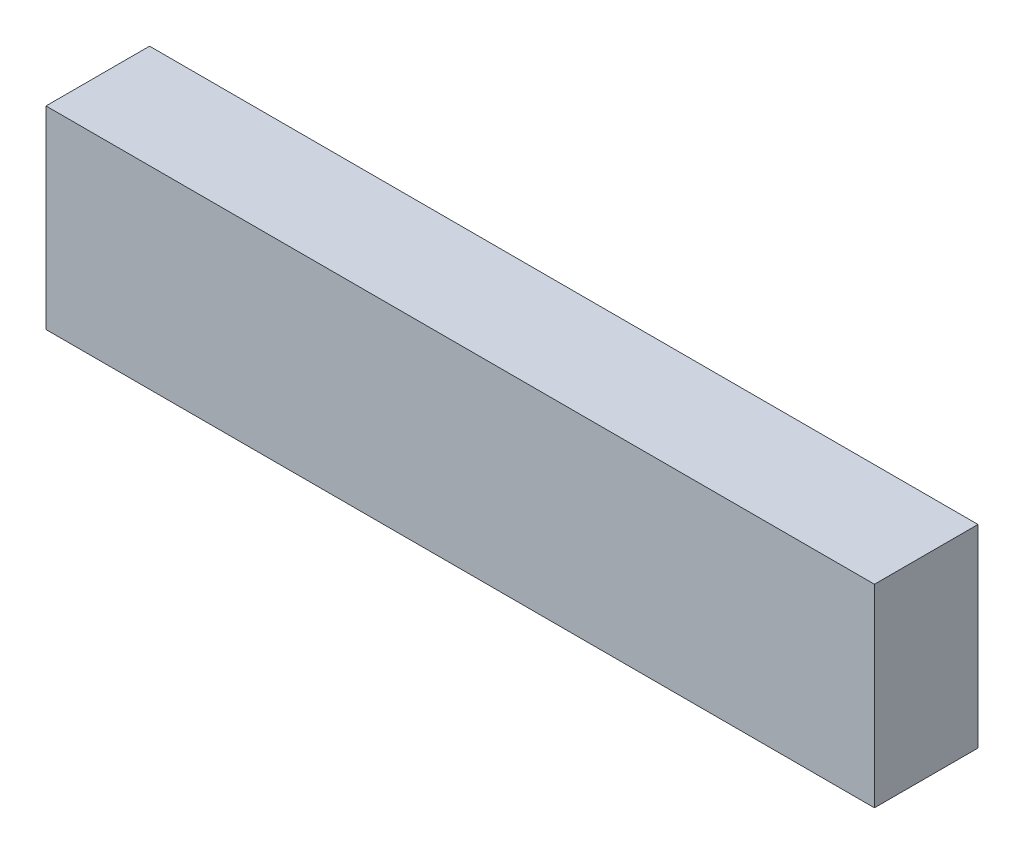
ISO-10303-21;
HEADER;
FILE_DESCRIPTION(('STEP AP214'),'2;1');
FILE_NAME('part.step','',(''),(''),'','','');
FILE_SCHEMA(('AUTOMOTIVE_DESIGN { 1 0 10303 214 1 1 1 1 }'));
ENDSEC;
DATA;
#1=APPLICATION_CONTEXT('core data for automotive mechanical design processes');
#2=APPLICATION_PROTOCOL_DEFINITION('international standard','automotive_design',2000,#1);
#3=PRODUCT_CONTEXT('',#1,'mechanical');
#4=PRODUCT('Part','Part','',(#3));
#5=PRODUCT_RELATED_PRODUCT_CATEGORY('part','',(#4));
#6=PRODUCT_DEFINITION_FORMATION('','',#4);
#7=PRODUCT_DEFINITION_CONTEXT('part definition',#1,'design');
#8=PRODUCT_DEFINITION('design','',#6,#7);
#9=PRODUCT_DEFINITION_SHAPE('','',#8);
#10=(LENGTH_UNIT() NAMED_UNIT(*) SI_UNIT(.MILLI.,.METRE.));
#11=(NAMED_UNIT(*) PLANE_ANGLE_UNIT() SI_UNIT($,.RADIAN.));
#12=(NAMED_UNIT(*) SI_UNIT($,.STERADIAN.) SOLID_ANGLE_UNIT());
#13=UNCERTAINTY_MEASURE_WITH_UNIT(LENGTH_MEASURE(1.E-05),#10,'distance_accuracy_value','');
#14=(GEOMETRIC_REPRESENTATION_CONTEXT(3) GLOBAL_UNCERTAINTY_ASSIGNED_CONTEXT((#13)) GLOBAL_UNIT_ASSIGNED_CONTEXT((#10,
#11,#12)) REPRESENTATION_CONTEXT('',''));
#15=CARTESIAN_POINT('',(0.,0.,0.));
#16=DIRECTION('',(0.,0.,1.));
#17=DIRECTION('',(1.,0.,0.));
#18=AXIS2_PLACEMENT_3D('',#15,#16,#17);
#19=CARTESIAN_POINT('',(0.,11.875,0.));
#20=DIRECTION('',(1.,0.,0.));
#21=DIRECTION('',(0.,0.,-1.));
#22=AXIS2_PLACEMENT_3D('',#19,#20,#21);
#23=PLANE('',#22);
#24=DIRECTION('',(0.,0.,1.));
#25=VECTOR('',#24,1.);
#26=CARTESIAN_POINT('',(0.,0.,0.));
#27=LINE('',#26,#25);
#28=CARTESIAN_POINT('',(0.,0.,0.));
#29=VERTEX_POINT('',#28);
#30=CARTESIAN_POINT('',(0.,0.,6.35));
#31=VERTEX_POINT('',#30);
#32=EDGE_CURVE('E113',#29,#31,#27,.T.);
#33=ORIENTED_EDGE('',*,*,#32,.T.);
#34=DIRECTION('',(0.,-1.,0.));
#35=VECTOR('',#34,1.);
#36=CARTESIAN_POINT('',(0.,11.875,6.35));
#37=LINE('',#36,#35);
#38=CARTESIAN_POINT('',(0.,11.875,6.35));
#39=VERTEX_POINT('',#38);
#40=EDGE_CURVE('E11',#39,#31,#37,.T.);
#41=ORIENTED_EDGE('',*,*,#40,.F.);
#42=DIRECTION('',(0.,0.,1.));
#43=VECTOR('',#42,1.);
#44=CARTESIAN_POINT('',(0.,11.875,0.));
#45=LINE('',#44,#43);
#46=CARTESIAN_POINT('',(0.,11.875,0.));
#47=VERTEX_POINT('',#46);
#48=EDGE_CURVE('E97',#47,#39,#45,.T.);
#49=ORIENTED_EDGE('',*,*,#48,.F.);
#50=DIRECTION('',(0.,-1.,0.));
#51=VECTOR('',#50,1.);
#52=CARTESIAN_POINT('',(0.,11.875,0.));
#53=LINE('',#52,#51);
#54=EDGE_CURVE('E109',#47,#29,#53,.T.);
#55=ORIENTED_EDGE('',*,*,#54,.T.);
#56=EDGE_LOOP('',(#33,#41,#49,#55));
#57=FACE_BOUND('',#56,.T.);
#58=ADVANCED_FACE('F45',(#57),#23,.F.);
#59=CARTESIAN_POINT('',(0.,11.875,6.35));
#60=DIRECTION('',(0.,0.,-1.));
#61=DIRECTION('',(-1.,0.,0.));
#62=AXIS2_PLACEMENT_3D('',#59,#60,#61);
#63=PLANE('',#62);
#64=DIRECTION('',(1.,0.,0.));
#65=VECTOR('',#64,1.);
#66=CARTESIAN_POINT('',(0.,0.,6.35));
#67=LINE('',#66,#65);
#68=CARTESIAN_POINT('',(50.8,0.,6.35));
#69=VERTEX_POINT('',#68);
#70=EDGE_CURVE('E102',#31,#69,#67,.T.);
#71=ORIENTED_EDGE('',*,*,#70,.T.);
#72=DIRECTION('',(0.,-1.,0.));
#73=VECTOR('',#72,1.);
#74=CARTESIAN_POINT('',(50.8,11.875,6.35));
#75=LINE('',#74,#73);
#76=CARTESIAN_POINT('',(50.8,11.875,6.35));
#77=VERTEX_POINT('',#76);
#78=EDGE_CURVE('E54',#77,#69,#75,.T.);
#79=ORIENTED_EDGE('',*,*,#78,.F.);
#80=DIRECTION('',(1.,0.,0.));
#81=VECTOR('',#80,1.);
#82=CARTESIAN_POINT('',(0.,11.875,6.35));
#83=LINE('',#82,#81);
#84=EDGE_CURVE('E92',#39,#77,#83,.T.);
#85=ORIENTED_EDGE('',*,*,#84,.F.);
#86=ORIENTED_EDGE('',*,*,#40,.T.);
#87=EDGE_LOOP('',(#71,#79,#85,#86));
#88=FACE_BOUND('',#87,.T.);
#89=ADVANCED_FACE('F101',(#88),#63,.F.);
#90=CARTESIAN_POINT('',(50.8,11.875,0.));
#91=DIRECTION('',(-1.,0.,0.));
#92=DIRECTION('',(0.,0.,1.));
#93=AXIS2_PLACEMENT_3D('',#90,#91,#92);
#94=PLANE('',#93);
#95=DIRECTION('',(0.,0.,-1.));
#96=VECTOR('',#95,1.);
#97=CARTESIAN_POINT('',(50.8,0.,0.));
#98=LINE('',#97,#96);
#99=CARTESIAN_POINT('',(50.8,0.,0.));
#100=VERTEX_POINT('',#99);
#101=EDGE_CURVE('E79',#69,#100,#98,.T.);
#102=ORIENTED_EDGE('',*,*,#101,.T.);
#103=DIRECTION('',(0.,-1.,0.));
#104=VECTOR('',#103,1.);
#105=CARTESIAN_POINT('',(50.8,11.875,0.));
#106=LINE('',#105,#104);
#107=CARTESIAN_POINT('',(50.8,11.875,0.));
#108=VERTEX_POINT('',#107);
#109=EDGE_CURVE('E104',#108,#100,#106,.T.);
#110=ORIENTED_EDGE('',*,*,#109,.F.);
#111=DIRECTION('',(0.,0.,-1.));
#112=VECTOR('',#111,1.);
#113=CARTESIAN_POINT('',(50.8,11.875,0.));
#114=LINE('',#113,#112);
#115=EDGE_CURVE('E95',#77,#108,#114,.T.);
#116=ORIENTED_EDGE('',*,*,#115,.F.);
#117=ORIENTED_EDGE('',*,*,#78,.T.);
#118=EDGE_LOOP('',(#102,#110,#116,#117));
#119=FACE_BOUND('',#118,.T.);
#120=ADVANCED_FACE('F105',(#119),#94,.F.);
#121=CARTESIAN_POINT('',(0.,11.875,0.));
#122=DIRECTION('',(0.,0.,1.));
#123=DIRECTION('',(1.,0.,0.));
#124=AXIS2_PLACEMENT_3D('',#121,#122,#123);
#125=PLANE('',#124);
#126=DIRECTION('',(-1.,0.,0.));
#127=VECTOR('',#126,1.);
#128=CARTESIAN_POINT('',(0.,0.,0.));
#129=LINE('',#128,#127);
#130=EDGE_CURVE('E85',#100,#29,#129,.T.);
#131=ORIENTED_EDGE('',*,*,#130,.T.);
#132=ORIENTED_EDGE('',*,*,#54,.F.);
#133=DIRECTION('',(-1.,0.,0.));
#134=VECTOR('',#133,1.);
#135=CARTESIAN_POINT('',(0.,11.875,0.));
#136=LINE('',#135,#134);
#137=EDGE_CURVE('E62',#108,#47,#136,.T.);
#138=ORIENTED_EDGE('',*,*,#137,.F.);
#139=ORIENTED_EDGE('',*,*,#109,.T.);
#140=EDGE_LOOP('',(#131,#132,#138,#139));
#141=FACE_BOUND('',#140,.T.);
#142=ADVANCED_FACE('F126',(#141),#125,.F.);
#143=CARTESIAN_POINT('',(0.,11.875,0.));
#144=DIRECTION('',(0.,1.,0.));
#145=DIRECTION('',(0.,0.,1.));
#146=AXIS2_PLACEMENT_3D('',#143,#144,#145);
#147=PLANE('',#146);
#148=ORIENTED_EDGE('',*,*,#48,.T.);
#149=ORIENTED_EDGE('',*,*,#84,.T.);
#150=ORIENTED_EDGE('',*,*,#115,.T.);
#151=ORIENTED_EDGE('',*,*,#137,.T.);
#152=EDGE_LOOP('',(#148,#149,#150,#151));
#153=FACE_BOUND('',#152,.T.);
#154=ADVANCED_FACE('F93',(#153),#147,.T.);
#155=CARTESIAN_POINT('',(0.,0.,0.));
#156=DIRECTION('',(0.,1.,0.));
#157=DIRECTION('',(0.,0.,1.));
#158=AXIS2_PLACEMENT_3D('',#155,#156,#157);
#159=PLANE('',#158);
#160=ORIENTED_EDGE('',*,*,#32,.F.);
#161=ORIENTED_EDGE('',*,*,#130,.F.);
#162=ORIENTED_EDGE('',*,*,#101,.F.);
#163=ORIENTED_EDGE('',*,*,#70,.F.);
#164=EDGE_LOOP('',(#160,#161,#162,#163));
#165=FACE_BOUND('',#164,.T.);
#166=ADVANCED_FACE('F129',(#165),#159,.F.);
#167=CLOSED_SHELL('',(#58,#89,#120,#142,#154,#166));
#168=MANIFOLD_SOLID_BREP('B2',#167);
#169=ADVANCED_BREP_SHAPE_REPRESENTATION('',(#18,#168),#14);
#170=SHAPE_DEFINITION_REPRESENTATION(#9,#169);
ENDSEC;
END-ISO-10303-21;
